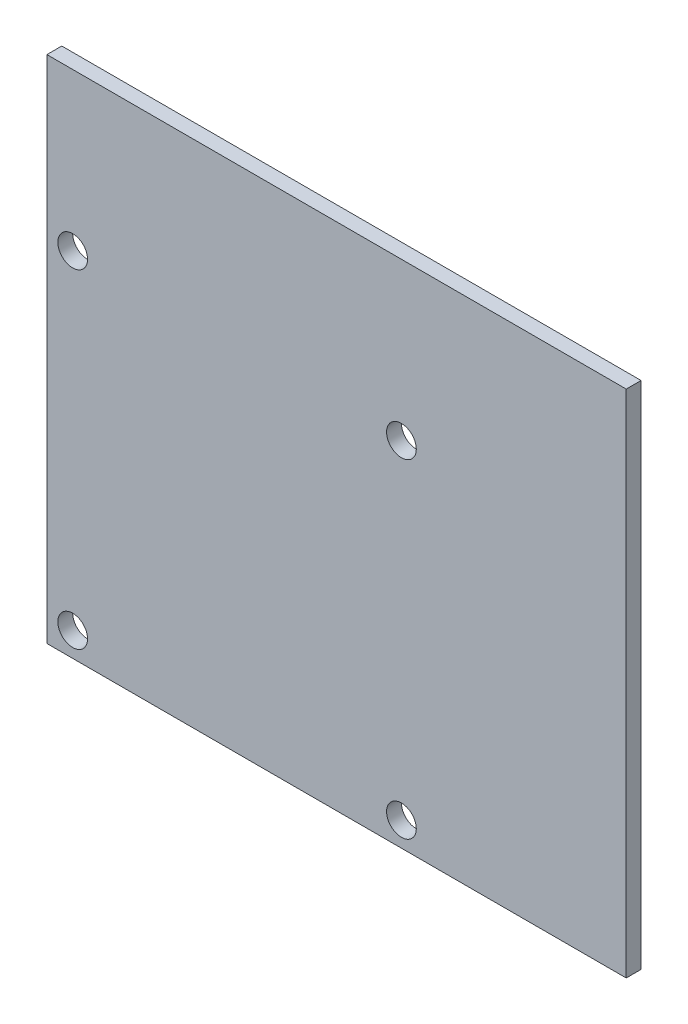
ISO-10303-21;
HEADER;
FILE_DESCRIPTION(('STEP AP214'),'2;1');
FILE_NAME('part.step','',(''),(''),'','','');
FILE_SCHEMA(('AUTOMOTIVE_DESIGN { 1 0 10303 214 1 1 1 1 }'));
ENDSEC;
DATA;
#1=APPLICATION_CONTEXT('core data for automotive mechanical design processes');
#2=APPLICATION_PROTOCOL_DEFINITION('international standard','automotive_design',2000,#1);
#3=PRODUCT_CONTEXT('',#1,'mechanical');
#4=PRODUCT('Part','Part','',(#3));
#5=PRODUCT_RELATED_PRODUCT_CATEGORY('part','',(#4));
#6=PRODUCT_DEFINITION_FORMATION('','',#4);
#7=PRODUCT_DEFINITION_CONTEXT('part definition',#1,'design');
#8=PRODUCT_DEFINITION('design','',#6,#7);
#9=PRODUCT_DEFINITION_SHAPE('','',#8);
#10=(LENGTH_UNIT() NAMED_UNIT(*) SI_UNIT(.MILLI.,.METRE.));
#11=(NAMED_UNIT(*) PLANE_ANGLE_UNIT() SI_UNIT($,.RADIAN.));
#12=(NAMED_UNIT(*) SI_UNIT($,.STERADIAN.) SOLID_ANGLE_UNIT());
#13=UNCERTAINTY_MEASURE_WITH_UNIT(LENGTH_MEASURE(1.E-05),#10,'distance_accuracy_value','');
#14=(GEOMETRIC_REPRESENTATION_CONTEXT(3) GLOBAL_UNCERTAINTY_ASSIGNED_CONTEXT((#13)) GLOBAL_UNIT_ASSIGNED_CONTEXT((#10,
#11,#12)) REPRESENTATION_CONTEXT('',''));
#15=CARTESIAN_POINT('',(0.,0.,0.));
#16=DIRECTION('',(0.,0.,1.));
#17=DIRECTION('',(1.,0.,0.));
#18=AXIS2_PLACEMENT_3D('',#15,#16,#17);
#19=CARTESIAN_POINT('',(25.398666666665,34.617900000002,-1.6));
#20=DIRECTION('',(0.,0.,1.));
#21=DIRECTION('',(1.,0.,0.));
#22=AXIS2_PLACEMENT_3D('',#19,#20,#21);
#23=PLANE('',#22);
#24=CARTESIAN_POINT('',(-34.21133333333,-17.69206666667,-1.6));
#25=DIRECTION('',(0.,0.,1.));
#26=DIRECTION('',(1.,0.,0.));
#27=AXIS2_PLACEMENT_3D('',#24,#25,#26);
#28=CIRCLE('',#27,1.600000000001);
#29=CARTESIAN_POINT('',(-32.611333333329,-17.69206666667,-1.6));
#30=VERTEX_POINT('',#29);
#31=EDGE_CURVE('E90',#30,#30,#28,.T.);
#32=ORIENTED_EDGE('',*,*,#31,.T.);
#33=EDGE_LOOP('',(#32));
#34=FACE_BOUND('',#33,.T.);
#35=CARTESIAN_POINT('',(1.188666666669,-17.69206666667,-1.6));
#36=DIRECTION('',(0.,0.,1.));
#37=DIRECTION('',(1.,0.,0.));
#38=AXIS2_PLACEMENT_3D('',#35,#36,#37);
#39=CIRCLE('',#38,1.600000000001);
#40=CARTESIAN_POINT('',(2.78866666667,-17.69206666667,-1.6));
#41=VERTEX_POINT('',#40);
#42=EDGE_CURVE('E94',#41,#41,#39,.T.);
#43=ORIENTED_EDGE('',*,*,#42,.T.);
#44=EDGE_LOOP('',(#43));
#45=FACE_BOUND('',#44,.T.);
#46=CARTESIAN_POINT('',(-34.21133333333,17.707933333334,-1.6));
#47=DIRECTION('',(0.,0.,1.));
#48=DIRECTION('',(1.,0.,0.));
#49=AXIS2_PLACEMENT_3D('',#46,#47,#48);
#50=CIRCLE('',#49,1.600000000001);
#51=CARTESIAN_POINT('',(-32.611333333329,17.707933333334,-1.6));
#52=VERTEX_POINT('',#51);
#53=EDGE_CURVE('E96',#52,#52,#50,.T.);
#54=ORIENTED_EDGE('',*,*,#53,.T.);
#55=EDGE_LOOP('',(#54));
#56=FACE_BOUND('',#55,.T.);
#57=CARTESIAN_POINT('',(1.188666666669,17.707933333334,-1.6));
#58=DIRECTION('',(0.,0.,1.));
#59=DIRECTION('',(1.,0.,0.));
#60=AXIS2_PLACEMENT_3D('',#57,#58,#59);
#61=CIRCLE('',#60,1.600000000001);
#62=CARTESIAN_POINT('',(2.78866666667,17.707933333334,-1.6));
#63=VERTEX_POINT('',#62);
#64=EDGE_CURVE('E19',#63,#63,#61,.T.);
#65=ORIENTED_EDGE('',*,*,#64,.T.);
#66=EDGE_LOOP('',(#65));
#67=FACE_BOUND('',#66,.T.);
#68=DIRECTION('',(1.,0.,0.));
#69=VECTOR('',#68,1.);
#70=CARTESIAN_POINT('',(25.398666666665,-20.30959999999,-1.6));
#71=LINE('',#70,#69);
#72=CARTESIAN_POINT('',(25.398666666665,-20.30959999999,-1.6));
#73=VERTEX_POINT('',#72);
#74=CARTESIAN_POINT('',(-36.9901,-20.30959999999,-1.6));
#75=VERTEX_POINT('',#74);
#76=EDGE_CURVE('E54',#73,#75,#71,.F.);
#77=ORIENTED_EDGE('',*,*,#76,.T.);
#78=DIRECTION('',(0.,1.,0.));
#79=VECTOR('',#78,1.);
#80=CARTESIAN_POINT('',(-36.9901,-20.30959999999,-1.6));
#81=LINE('',#80,#79);
#82=CARTESIAN_POINT('',(-36.9901,34.617900000002,-1.6));
#83=VERTEX_POINT('',#82);
#84=EDGE_CURVE('E56',#75,#83,#81,.T.);
#85=ORIENTED_EDGE('',*,*,#84,.T.);
#86=DIRECTION('',(1.,0.,0.));
#87=VECTOR('',#86,1.);
#88=CARTESIAN_POINT('',(-36.9901,34.617900000002,-1.6));
#89=LINE('',#88,#87);
#90=CARTESIAN_POINT('',(25.398666666665,34.617900000002,-1.6));
#91=VERTEX_POINT('',#90);
#92=EDGE_CURVE('E58',#83,#91,#89,.T.);
#93=ORIENTED_EDGE('',*,*,#92,.T.);
#94=DIRECTION('',(0.,1.,0.));
#95=VECTOR('',#94,1.);
#96=CARTESIAN_POINT('',(25.398666666665,34.617900000002,-1.6));
#97=LINE('',#96,#95);
#98=EDGE_CURVE('E103',#91,#73,#97,.F.);
#99=ORIENTED_EDGE('',*,*,#98,.T.);
#100=EDGE_LOOP('',(#77,#85,#93,#99));
#101=FACE_BOUND('',#100,.T.);
#102=ADVANCED_FACE('F16',(#34,#45,#56,#67,#101),#23,.F.);
#103=CARTESIAN_POINT('',(-36.9901,34.617900000002,0.));
#104=DIRECTION('',(0.,-1.,0.));
#105=DIRECTION('',(0.,0.,-1.));
#106=AXIS2_PLACEMENT_3D('',#103,#104,#105);
#107=PLANE('',#106);
#108=DIRECTION('',(0.,0.,1.));
#109=VECTOR('',#108,1.);
#110=CARTESIAN_POINT('',(25.398666666665,34.617900000002,0.));
#111=LINE('',#110,#109);
#112=CARTESIAN_POINT('',(25.398666666665,34.617900000002,0.));
#113=VERTEX_POINT('',#112);
#114=EDGE_CURVE('E69',#113,#91,#111,.F.);
#115=ORIENTED_EDGE('',*,*,#114,.T.);
#116=ORIENTED_EDGE('',*,*,#92,.F.);
#117=DIRECTION('',(0.,0.,-1.));
#118=VECTOR('',#117,1.);
#119=CARTESIAN_POINT('',(-36.9901,34.617900000002,0.));
#120=LINE('',#119,#118);
#121=CARTESIAN_POINT('',(-36.9901,34.617900000002,0.));
#122=VERTEX_POINT('',#121);
#123=EDGE_CURVE('E63',#83,#122,#120,.F.);
#124=ORIENTED_EDGE('',*,*,#123,.T.);
#125=DIRECTION('',(1.,0.,0.));
#126=VECTOR('',#125,1.);
#127=CARTESIAN_POINT('',(25.398666666665,34.617900000002,0.));
#128=LINE('',#127,#126);
#129=EDGE_CURVE('E93',#113,#122,#128,.F.);
#130=ORIENTED_EDGE('',*,*,#129,.F.);
#131=EDGE_LOOP('',(#115,#116,#124,#130));
#132=FACE_BOUND('',#131,.T.);
#133=ADVANCED_FACE('F66',(#132),#107,.F.);
#134=CARTESIAN_POINT('',(-36.9901,-20.30959999999,0.));
#135=DIRECTION('',(1.,0.,0.));
#136=DIRECTION('',(0.,0.,-1.));
#137=AXIS2_PLACEMENT_3D('',#134,#135,#136);
#138=PLANE('',#137);
#139=ORIENTED_EDGE('',*,*,#123,.F.);
#140=ORIENTED_EDGE('',*,*,#84,.F.);
#141=DIRECTION('',(0.,0.,1.));
#142=VECTOR('',#141,1.);
#143=CARTESIAN_POINT('',(-36.9901,-20.30959999999,0.));
#144=LINE('',#143,#142);
#145=CARTESIAN_POINT('',(-36.9901,-20.30959999999,0.));
#146=VERTEX_POINT('',#145);
#147=EDGE_CURVE('E77',#75,#146,#144,.T.);
#148=ORIENTED_EDGE('',*,*,#147,.T.);
#149=DIRECTION('',(0.,1.,0.));
#150=VECTOR('',#149,1.);
#151=CARTESIAN_POINT('',(-36.9901,34.617900000002,0.));
#152=LINE('',#151,#150);
#153=EDGE_CURVE('E74',#122,#146,#152,.F.);
#154=ORIENTED_EDGE('',*,*,#153,.F.);
#155=EDGE_LOOP('',(#139,#140,#148,#154));
#156=FACE_BOUND('',#155,.T.);
#157=ADVANCED_FACE('F72',(#156),#138,.F.);
#158=CARTESIAN_POINT('',(25.398666666665,-20.30959999999,0.));
#159=DIRECTION('',(0.,1.,0.));
#160=DIRECTION('',(0.,0.,1.));
#161=AXIS2_PLACEMENT_3D('',#158,#159,#160);
#162=PLANE('',#161);
#163=ORIENTED_EDGE('',*,*,#147,.F.);
#164=ORIENTED_EDGE('',*,*,#76,.F.);
#165=DIRECTION('',(0.,0.,1.));
#166=VECTOR('',#165,1.);
#167=CARTESIAN_POINT('',(25.398666666665,-20.30959999999,0.));
#168=LINE('',#167,#166);
#169=CARTESIAN_POINT('',(25.398666666665,-20.30959999999,0.));
#170=VERTEX_POINT('',#169);
#171=EDGE_CURVE('E34',#73,#170,#168,.T.);
#172=ORIENTED_EDGE('',*,*,#171,.T.);
#173=DIRECTION('',(1.,0.,0.));
#174=VECTOR('',#173,1.);
#175=CARTESIAN_POINT('',(25.398666666665,-20.30959999999,0.));
#176=LINE('',#175,#174);
#177=EDGE_CURVE('E110',#146,#170,#176,.T.);
#178=ORIENTED_EDGE('',*,*,#177,.F.);
#179=EDGE_LOOP('',(#163,#164,#172,#178));
#180=FACE_BOUND('',#179,.T.);
#181=ADVANCED_FACE('F111',(#180),#162,.F.);
#182=CARTESIAN_POINT('',(25.398666666665,34.617900000002,0.));
#183=DIRECTION('',(-1.,0.,0.));
#184=DIRECTION('',(0.,0.,1.));
#185=AXIS2_PLACEMENT_3D('',#182,#183,#184);
#186=PLANE('',#185);
#187=ORIENTED_EDGE('',*,*,#171,.F.);
#188=ORIENTED_EDGE('',*,*,#98,.F.);
#189=ORIENTED_EDGE('',*,*,#114,.F.);
#190=DIRECTION('',(0.,1.,0.));
#191=VECTOR('',#190,1.);
#192=CARTESIAN_POINT('',(25.398666666665,34.617900000002,0.));
#193=LINE('',#192,#191);
#194=EDGE_CURVE('E89',#170,#113,#193,.T.);
#195=ORIENTED_EDGE('',*,*,#194,.F.);
#196=EDGE_LOOP('',(#187,#188,#189,#195));
#197=FACE_BOUND('',#196,.T.);
#198=ADVANCED_FACE('F118',(#197),#186,.F.);
#199=CARTESIAN_POINT('',(1.188666666669,17.707933333334,0.));
#200=DIRECTION('',(0.,0.,1.));
#201=DIRECTION('',(1.,0.,0.));
#202=AXIS2_PLACEMENT_3D('',#199,#200,#201);
#203=CYLINDRICAL_SURFACE('',#202,1.600000000001);
#204=ORIENTED_EDGE('',*,*,#64,.F.);
#205=EDGE_LOOP('',(#204));
#206=FACE_BOUND('',#205,.T.);
#207=CARTESIAN_POINT('',(1.188666666669,17.707933333334,0.));
#208=DIRECTION('',(0.,0.,1.));
#209=DIRECTION('',(1.,0.,0.));
#210=AXIS2_PLACEMENT_3D('',#207,#208,#209);
#211=CIRCLE('',#210,1.600000000001);
#212=CARTESIAN_POINT('',(2.78866666667,17.707933333334,0.));
#213=VERTEX_POINT('',#212);
#214=EDGE_CURVE('E86',#213,#213,#211,.T.);
#215=ORIENTED_EDGE('',*,*,#214,.T.);
#216=EDGE_LOOP('',(#215));
#217=FACE_BOUND('',#216,.T.);
#218=ADVANCED_FACE('F120',(#206,#217),#203,.F.);
#219=CARTESIAN_POINT('',(-34.21133333333,17.707933333334,0.));
#220=DIRECTION('',(0.,0.,1.));
#221=DIRECTION('',(1.,0.,0.));
#222=AXIS2_PLACEMENT_3D('',#219,#220,#221);
#223=CYLINDRICAL_SURFACE('',#222,1.600000000001);
#224=ORIENTED_EDGE('',*,*,#53,.F.);
#225=EDGE_LOOP('',(#224));
#226=FACE_BOUND('',#225,.T.);
#227=CARTESIAN_POINT('',(-34.21133333333,17.707933333334,0.));
#228=DIRECTION('',(0.,0.,1.));
#229=DIRECTION('',(1.,0.,0.));
#230=AXIS2_PLACEMENT_3D('',#227,#228,#229);
#231=CIRCLE('',#230,1.600000000001);
#232=CARTESIAN_POINT('',(-32.611333333329,17.707933333334,0.));
#233=VERTEX_POINT('',#232);
#234=EDGE_CURVE('E83',#233,#233,#231,.T.);
#235=ORIENTED_EDGE('',*,*,#234,.T.);
#236=EDGE_LOOP('',(#235));
#237=FACE_BOUND('',#236,.T.);
#238=ADVANCED_FACE('F127',(#226,#237),#223,.F.);
#239=CARTESIAN_POINT('',(1.188666666669,-17.69206666667,0.));
#240=DIRECTION('',(0.,0.,1.));
#241=DIRECTION('',(1.,0.,0.));
#242=AXIS2_PLACEMENT_3D('',#239,#240,#241);
#243=CYLINDRICAL_SURFACE('',#242,1.600000000001);
#244=ORIENTED_EDGE('',*,*,#42,.F.);
#245=EDGE_LOOP('',(#244));
#246=FACE_BOUND('',#245,.T.);
#247=CARTESIAN_POINT('',(1.188666666669,-17.69206666667,0.));
#248=DIRECTION('',(0.,0.,1.));
#249=DIRECTION('',(1.,0.,0.));
#250=AXIS2_PLACEMENT_3D('',#247,#248,#249);
#251=CIRCLE('',#250,1.600000000001);
#252=CARTESIAN_POINT('',(2.78866666667,-17.69206666667,0.));
#253=VERTEX_POINT('',#252);
#254=EDGE_CURVE('E25',#253,#253,#251,.T.);
#255=ORIENTED_EDGE('',*,*,#254,.T.);
#256=EDGE_LOOP('',(#255));
#257=FACE_BOUND('',#256,.T.);
#258=ADVANCED_FACE('F138',(#246,#257),#243,.F.);
#259=CARTESIAN_POINT('',(-34.21133333333,-17.69206666667,0.));
#260=DIRECTION('',(0.,0.,1.));
#261=DIRECTION('',(1.,0.,0.));
#262=AXIS2_PLACEMENT_3D('',#259,#260,#261);
#263=CYLINDRICAL_SURFACE('',#262,1.600000000001);
#264=ORIENTED_EDGE('',*,*,#31,.F.);
#265=EDGE_LOOP('',(#264));
#266=FACE_BOUND('',#265,.T.);
#267=CARTESIAN_POINT('',(-34.21133333333,-17.69206666667,0.));
#268=DIRECTION('',(0.,0.,1.));
#269=DIRECTION('',(1.,0.,0.));
#270=AXIS2_PLACEMENT_3D('',#267,#268,#269);
#271=CIRCLE('',#270,1.600000000001);
#272=CARTESIAN_POINT('',(-32.611333333329,-17.69206666667,0.));
#273=VERTEX_POINT('',#272);
#274=EDGE_CURVE('E11',#273,#273,#271,.T.);
#275=ORIENTED_EDGE('',*,*,#274,.T.);
#276=EDGE_LOOP('',(#275));
#277=FACE_BOUND('',#276,.T.);
#278=ADVANCED_FACE('F132',(#266,#277),#263,.F.);
#279=CARTESIAN_POINT('',(25.398666666665,34.617900000002,0.));
#280=DIRECTION('',(0.,0.,1.));
#281=DIRECTION('',(1.,0.,0.));
#282=AXIS2_PLACEMENT_3D('',#279,#280,#281);
#283=PLANE('',#282);
#284=ORIENTED_EDGE('',*,*,#274,.F.);
#285=EDGE_LOOP('',(#284));
#286=FACE_BOUND('',#285,.T.);
#287=ORIENTED_EDGE('',*,*,#254,.F.);
#288=EDGE_LOOP('',(#287));
#289=FACE_BOUND('',#288,.T.);
#290=ORIENTED_EDGE('',*,*,#234,.F.);
#291=EDGE_LOOP('',(#290));
#292=FACE_BOUND('',#291,.T.);
#293=ORIENTED_EDGE('',*,*,#214,.F.);
#294=EDGE_LOOP('',(#293));
#295=FACE_BOUND('',#294,.T.);
#296=ORIENTED_EDGE('',*,*,#177,.T.);
#297=ORIENTED_EDGE('',*,*,#194,.T.);
#298=ORIENTED_EDGE('',*,*,#129,.T.);
#299=ORIENTED_EDGE('',*,*,#153,.T.);
#300=EDGE_LOOP('',(#296,#297,#298,#299));
#301=FACE_BOUND('',#300,.T.);
#302=ADVANCED_FACE('F115',(#286,#289,#292,#295,#301),#283,.T.);
#303=CLOSED_SHELL('',(#102,#133,#157,#181,#198,#218,#238,#258,#278,#302));
#304=MANIFOLD_SOLID_BREP('B1',#303);
#305=ADVANCED_BREP_SHAPE_REPRESENTATION('',(#18,#304),#14);
#306=SHAPE_DEFINITION_REPRESENTATION(#9,#305);
ENDSEC;
END-ISO-10303-21;
